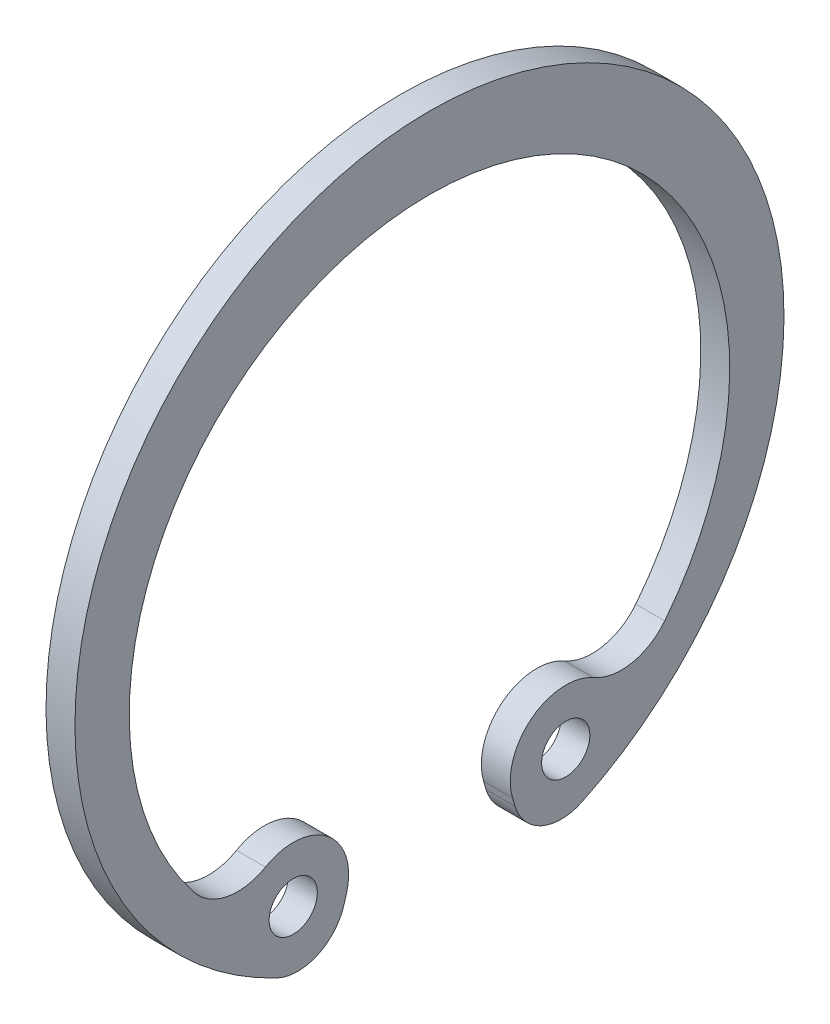
ISO-10303-21;
HEADER;
FILE_DESCRIPTION(('STEP AP214'),'2;1');
FILE_NAME('part.step','',(''),(''),'','','');
FILE_SCHEMA(('AUTOMOTIVE_DESIGN { 1 0 10303 214 1 1 1 1 }'));
ENDSEC;
DATA;
#1=APPLICATION_CONTEXT('core data for automotive mechanical design processes');
#2=APPLICATION_PROTOCOL_DEFINITION('international standard','automotive_design',2000,#1);
#3=PRODUCT_CONTEXT('',#1,'mechanical');
#4=PRODUCT('Part','Part','',(#3));
#5=PRODUCT_RELATED_PRODUCT_CATEGORY('part','',(#4));
#6=PRODUCT_DEFINITION_FORMATION('','',#4);
#7=PRODUCT_DEFINITION_CONTEXT('part definition',#1,'design');
#8=PRODUCT_DEFINITION('design','',#6,#7);
#9=PRODUCT_DEFINITION_SHAPE('','',#8);
#10=(LENGTH_UNIT() NAMED_UNIT(*) SI_UNIT(.MILLI.,.METRE.));
#11=(NAMED_UNIT(*) PLANE_ANGLE_UNIT() SI_UNIT($,.RADIAN.));
#12=(NAMED_UNIT(*) SI_UNIT($,.STERADIAN.) SOLID_ANGLE_UNIT());
#13=UNCERTAINTY_MEASURE_WITH_UNIT(LENGTH_MEASURE(1.E-05),#10,'distance_accuracy_value','');
#14=(GEOMETRIC_REPRESENTATION_CONTEXT(3) GLOBAL_UNCERTAINTY_ASSIGNED_CONTEXT((#13)) GLOBAL_UNIT_ASSIGNED_CONTEXT((#10,
#11,#12)) REPRESENTATION_CONTEXT('',''));
#15=CARTESIAN_POINT('',(0.,0.,0.));
#16=DIRECTION('',(0.,0.,1.));
#17=DIRECTION('',(1.,0.,0.));
#18=AXIS2_PLACEMENT_3D('',#15,#16,#17);
#19=CARTESIAN_POINT('',(0.6,-11.4649523103758,-5.46304571835183));
#20=DIRECTION('',(-1.,0.,0.));
#21=DIRECTION('',(0.,-0.902752150423427,-0.430161080184945));
#22=AXIS2_PLACEMENT_3D('',#19,#20,#21);
#23=CYLINDRICAL_SURFACE('',#22,2.00000000000042);
#24=CARTESIAN_POINT('',(-0.6,-11.4649523103758,-5.46304571835183));
#25=DIRECTION('',(1.,0.,0.));
#26=DIRECTION('',(0.,-0.28262789167806,0.959229625713059));
#27=AXIS2_PLACEMENT_3D('',#24,#25,#26);
#28=CIRCLE('',#27,2.00000000000042);
#29=CARTESIAN_POINT('',(-0.6,-12.030208093732,-3.5445864669253));
#30=VERTEX_POINT('',#29);
#31=CARTESIAN_POINT('',(-0.6,-13.270456611223,-6.3233678787219));
#32=VERTEX_POINT('',#31);
#33=EDGE_CURVE('E96',#30,#32,#28,.T.);
#34=ORIENTED_EDGE('',*,*,#33,.T.);
#35=DIRECTION('',(1.,0.,0.));
#36=VECTOR('',#35,1.);
#37=CARTESIAN_POINT('',(-0.6,-13.270456611223,-6.3233678787219));
#38=LINE('',#37,#36);
#39=CARTESIAN_POINT('',(0.6,-13.270456611223,-6.3233678787219));
#40=VERTEX_POINT('',#39);
#41=EDGE_CURVE('E110',#40,#32,#38,.F.);
#42=ORIENTED_EDGE('',*,*,#41,.F.);
#43=CARTESIAN_POINT('',(0.6,-11.4649523103758,-5.46304571835183));
#44=DIRECTION('',(-1.,0.,0.));
#45=DIRECTION('',(0.,-0.902752150423427,-0.430161080184944));
#46=AXIS2_PLACEMENT_3D('',#43,#44,#45);
#47=CIRCLE('',#46,2.00000000000042);
#48=CARTESIAN_POINT('',(0.6,-12.030208093732,-3.5445864669253));
#49=VERTEX_POINT('',#48);
#50=EDGE_CURVE('E116',#49,#40,#47,.F.);
#51=ORIENTED_EDGE('',*,*,#50,.F.);
#52=DIRECTION('',(-1.,0.,0.));
#53=VECTOR('',#52,1.);
#54=CARTESIAN_POINT('',(0.6,-12.030208093732,-3.5445864669253));
#55=LINE('',#54,#53);
#56=EDGE_CURVE('E104',#49,#30,#55,.T.);
#57=ORIENTED_EDGE('',*,*,#56,.T.);
#58=EDGE_LOOP('',(#34,#42,#51,#57));
#59=FACE_BOUND('',#58,.T.);
#60=ADVANCED_FACE('F17',(#59),#23,.T.);
#61=CARTESIAN_POINT('',(0.6,0.,0.));
#62=DIRECTION('',(-1.,0.,0.));
#63=DIRECTION('',(0.,1.,0.));
#64=AXIS2_PLACEMENT_3D('',#61,#62,#63);
#65=CYLINDRICAL_SURFACE('',#64,14.7);
#66=ORIENTED_EDGE('',*,*,#41,.T.);
#67=CARTESIAN_POINT('',(-0.6,0.,0.));
#68=DIRECTION('',(1.,0.,0.));
#69=DIRECTION('',(0.,-0.902752150423324,-0.430161080185161));
#70=AXIS2_PLACEMENT_3D('',#67,#68,#69);
#71=CIRCLE('',#70,14.7);
#72=CARTESIAN_POINT('',(-0.6,-13.2704566112229,6.32336787872187));
#73=VERTEX_POINT('',#72);
#74=EDGE_CURVE('E92',#32,#73,#71,.T.);
#75=ORIENTED_EDGE('',*,*,#74,.T.);
#76=DIRECTION('',(1.,0.,0.));
#77=VECTOR('',#76,1.);
#78=CARTESIAN_POINT('',(-0.6,-13.2704566112229,6.32336787872186));
#79=LINE('',#78,#77);
#80=CARTESIAN_POINT('',(0.6,-13.2704566112229,6.32336787872186));
#81=VERTEX_POINT('',#80);
#82=EDGE_CURVE('E103',#81,#73,#79,.F.);
#83=ORIENTED_EDGE('',*,*,#82,.F.);
#84=CARTESIAN_POINT('',(0.6,0.,0.));
#85=DIRECTION('',(-1.,0.,0.));
#86=DIRECTION('',(0.,-0.902752150423324,0.430161080185161));
#87=AXIS2_PLACEMENT_3D('',#84,#85,#86);
#88=CIRCLE('',#87,14.7);
#89=EDGE_CURVE('E115',#40,#81,#88,.F.);
#90=ORIENTED_EDGE('',*,*,#89,.F.);
#91=EDGE_LOOP('',(#66,#75,#83,#90));
#92=FACE_BOUND('',#91,.T.);
#93=ADVANCED_FACE('F114',(#92),#65,.T.);
#94=CARTESIAN_POINT('',(0.6,-11.4649523103758,5.46304571835183));
#95=DIRECTION('',(-1.,0.,0.));
#96=DIRECTION('',(0.,-0.282627891678059,-0.959229625713059));
#97=AXIS2_PLACEMENT_3D('',#94,#95,#96);
#98=CYLINDRICAL_SURFACE('',#97,2.00000000000042);
#99=CARTESIAN_POINT('',(-0.6,-11.4649523103758,5.46304571835183));
#100=DIRECTION('',(1.,0.,0.));
#101=DIRECTION('',(0.,-0.902752150423429,0.430161080184941));
#102=AXIS2_PLACEMENT_3D('',#99,#100,#101);
#103=CIRCLE('',#102,2.00000000000042);
#104=CARTESIAN_POINT('',(-0.6,-12.030208093732,3.5445864669253));
#105=VERTEX_POINT('',#104);
#106=EDGE_CURVE('E98',#73,#105,#103,.T.);
#107=ORIENTED_EDGE('',*,*,#106,.T.);
#108=DIRECTION('',(1.,0.,0.));
#109=VECTOR('',#108,1.);
#110=CARTESIAN_POINT('',(-0.6,-12.030208093732,3.5445864669253));
#111=LINE('',#110,#109);
#112=CARTESIAN_POINT('',(0.6,-12.030208093732,3.5445864669253));
#113=VERTEX_POINT('',#112);
#114=EDGE_CURVE('E138',#113,#105,#111,.F.);
#115=ORIENTED_EDGE('',*,*,#114,.F.);
#116=CARTESIAN_POINT('',(0.6,-11.4649523103758,5.46304571835183));
#117=DIRECTION('',(-1.,0.,0.));
#118=DIRECTION('',(0.,-0.282627891678059,-0.959229625713059));
#119=AXIS2_PLACEMENT_3D('',#116,#117,#118);
#120=CIRCLE('',#119,2.00000000000042);
#121=EDGE_CURVE('E143',#81,#113,#120,.F.);
#122=ORIENTED_EDGE('',*,*,#121,.F.);
#123=ORIENTED_EDGE('',*,*,#82,.T.);
#124=EDGE_LOOP('',(#107,#115,#122,#123));
#125=FACE_BOUND('',#124,.T.);
#126=ADVANCED_FACE('F263',(#125),#98,.T.);
#127=CARTESIAN_POINT('',(-0.6,-11.68804668755,3.4437718608598));
#128=DIRECTION('',(0.,-0.282627891677525,-0.959229625713216));
#129=DIRECTION('',(1.,0.,0.));
#130=AXIS2_PLACEMENT_3D('',#127,#128,#129);
#131=PLANE('',#130);
#132=DIRECTION('',(0.,0.959229625713217,-0.282627891677525));
#133=VECTOR('',#132,1.);
#134=CARTESIAN_POINT('',(-0.6,-12.030208093732,3.5445864669253));
#135=LINE('',#134,#133);
#136=CARTESIAN_POINT('',(-0.6,-11.68804668755,3.4437718608598));
#137=VERTEX_POINT('',#136);
#138=EDGE_CURVE('E147',#105,#137,#135,.T.);
#139=ORIENTED_EDGE('',*,*,#138,.T.);
#140=DIRECTION('',(1.,0.,0.));
#141=VECTOR('',#140,1.);
#142=CARTESIAN_POINT('',(-0.6,-11.68804668755,3.4437718608598));
#143=LINE('',#142,#141);
#144=CARTESIAN_POINT('',(0.6,-11.68804668755,3.4437718608598));
#145=VERTEX_POINT('',#144);
#146=EDGE_CURVE('E152',#145,#137,#143,.F.);
#147=ORIENTED_EDGE('',*,*,#146,.F.);
#148=DIRECTION('',(0.,-0.959229625713217,0.282627891677525));
#149=VECTOR('',#148,1.);
#150=CARTESIAN_POINT('',(0.6,-11.68804668755,3.4437718608598));
#151=LINE('',#150,#149);
#152=EDGE_CURVE('E157',#113,#145,#151,.F.);
#153=ORIENTED_EDGE('',*,*,#152,.F.);
#154=ORIENTED_EDGE('',*,*,#114,.T.);
#155=EDGE_LOOP('',(#139,#147,#153,#154));
#156=FACE_BOUND('',#155,.T.);
#157=ADVANCED_FACE('F268',(#156),#131,.T.);
#158=CARTESIAN_POINT('',(0.6,-11.0380025366911,5.65));
#159=DIRECTION('',(-1.,0.,0.));
#160=DIRECTION('',(0.,0.865613782187152,0.500712272755176));
#161=AXIS2_PLACEMENT_3D('',#158,#159,#160);
#162=CYLINDRICAL_SURFACE('',#161,2.3);
#163=CARTESIAN_POINT('',(-0.6,-11.0380025366911,5.65));
#164=DIRECTION('',(1.,0.,0.));
#165=DIRECTION('',(0.,-0.282627891677771,-0.959229625713144));
#166=AXIS2_PLACEMENT_3D('',#163,#164,#165);
#167=CIRCLE('',#166,2.3);
#168=CARTESIAN_POINT('',(-0.6,-9.04709083766069,6.80163822733691));
#169=VERTEX_POINT('',#168);
#170=EDGE_CURVE('E161',#137,#169,#167,.T.);
#171=ORIENTED_EDGE('',*,*,#170,.T.);
#172=DIRECTION('',(1.,0.,0.));
#173=VECTOR('',#172,1.);
#174=CARTESIAN_POINT('',(-0.6,-9.04709083766069,6.80163822733691));
#175=LINE('',#174,#173);
#176=CARTESIAN_POINT('',(0.6,-9.04709083766069,6.80163822733691));
#177=VERTEX_POINT('',#176);
#178=EDGE_CURVE('E166',#177,#169,#175,.F.);
#179=ORIENTED_EDGE('',*,*,#178,.F.);
#180=CARTESIAN_POINT('',(0.6,-11.0380025366911,5.65));
#181=DIRECTION('',(-1.,0.,0.));
#182=DIRECTION('',(0.,0.865613782187152,0.500712272755177));
#183=AXIS2_PLACEMENT_3D('',#180,#181,#182);
#184=CIRCLE('',#183,2.3);
#185=EDGE_CURVE('E171',#145,#177,#184,.F.);
#186=ORIENTED_EDGE('',*,*,#185,.F.);
#187=ORIENTED_EDGE('',*,*,#146,.T.);
#188=EDGE_LOOP('',(#171,#179,#186,#187));
#189=FACE_BOUND('',#188,.T.);
#190=ADVANCED_FACE('F272',(#189),#162,.T.);
#191=CARTESIAN_POINT('',(0.6,-7.05617909642331,7.95327638170799));
#192=DIRECTION('',(-1.,0.,0.));
#193=DIRECTION('',(0.,-0.865613800537984,-0.500712241030902));
#194=AXIS2_PLACEMENT_3D('',#191,#192,#193);
#195=CYLINDRICAL_SURFACE('',#194,2.30000000000003);
#196=CARTESIAN_POINT('',(-0.6,-7.05617909642331,7.95327638170799));
#197=DIRECTION('',(-1.,0.,0.));
#198=DIRECTION('',(0.,-0.865613800537984,-0.500712241030901));
#199=AXIS2_PLACEMENT_3D('',#196,#197,#198);
#200=CIRCLE('',#199,2.30000000000003);
#201=CARTESIAN_POINT('',(-0.6,-8.4851654926572,9.7554966455433));
#202=VERTEX_POINT('',#201);
#203=EDGE_CURVE('E175',#202,#169,#200,.F.);
#204=ORIENTED_EDGE('',*,*,#203,.F.);
#205=DIRECTION('',(1.,0.,0.));
#206=VECTOR('',#205,1.);
#207=CARTESIAN_POINT('',(-0.6,-8.4851654926572,9.7554966455433));
#208=LINE('',#207,#206);
#209=CARTESIAN_POINT('',(0.6,-8.48516549265719,9.75549664554331));
#210=VERTEX_POINT('',#209);
#211=EDGE_CURVE('E179',#210,#202,#208,.F.);
#212=ORIENTED_EDGE('',*,*,#211,.F.);
#213=CARTESIAN_POINT('',(0.6,-7.05617909642331,7.95327638170799));
#214=DIRECTION('',(1.,0.,0.));
#215=DIRECTION('',(0.,-0.62129843314516,0.783574027754474));
#216=AXIS2_PLACEMENT_3D('',#213,#214,#215);
#217=CIRCLE('',#216,2.30000000000003);
#218=EDGE_CURVE('E184',#210,#177,#217,.T.);
#219=ORIENTED_EDGE('',*,*,#218,.T.);
#220=ORIENTED_EDGE('',*,*,#178,.T.);
#221=EDGE_LOOP('',(#204,#212,#219,#220));
#222=FACE_BOUND('',#221,.T.);
#223=ADVANCED_FACE('F276',(#222),#195,.F.);
#224=CARTESIAN_POINT('',(0.6,-0.750000000000032,0.));
#225=DIRECTION('',(-1.,0.,0.));
#226=DIRECTION('',(0.,-0.621298433145152,0.78357402775448));
#227=AXIS2_PLACEMENT_3D('',#224,#225,#226);
#228=CYLINDRICAL_SURFACE('',#227,12.45);
#229=ORIENTED_EDGE('',*,*,#211,.T.);
#230=CARTESIAN_POINT('',(-0.6,-0.750000000000032,0.));
#231=DIRECTION('',(-1.,0.,0.));
#232=DIRECTION('',(0.,-0.621298433145152,0.78357402775448));
#233=AXIS2_PLACEMENT_3D('',#230,#231,#232);
#234=CIRCLE('',#233,12.45);
#235=CARTESIAN_POINT('',(-0.6,-8.48516549265717,-9.75549664554328));
#236=VERTEX_POINT('',#235);
#237=EDGE_CURVE('E189',#236,#202,#234,.F.);
#238=ORIENTED_EDGE('',*,*,#237,.F.);
#239=DIRECTION('',(1.,0.,0.));
#240=VECTOR('',#239,1.);
#241=CARTESIAN_POINT('',(-0.6,-8.48516549265718,-9.75549664554328));
#242=LINE('',#241,#240);
#243=CARTESIAN_POINT('',(0.6,-8.48516549265718,-9.75549664554328));
#244=VERTEX_POINT('',#243);
#245=EDGE_CURVE('E193',#244,#236,#242,.F.);
#246=ORIENTED_EDGE('',*,*,#245,.F.);
#247=CARTESIAN_POINT('',(0.6,-0.750000000000032,0.));
#248=DIRECTION('',(1.,0.,0.));
#249=DIRECTION('',(0.,-0.621298433145152,-0.78357402775448));
#250=AXIS2_PLACEMENT_3D('',#247,#248,#249);
#251=CIRCLE('',#250,12.45);
#252=EDGE_CURVE('E198',#244,#210,#251,.T.);
#253=ORIENTED_EDGE('',*,*,#252,.T.);
#254=EDGE_LOOP('',(#229,#238,#246,#253));
#255=FACE_BOUND('',#254,.T.);
#256=ADVANCED_FACE('F280',(#255),#228,.F.);
#257=CARTESIAN_POINT('',(0.6,-7.05617909642331,-7.95327638170799));
#258=DIRECTION('',(-1.,0.,0.));
#259=DIRECTION('',(0.,-0.621298433145161,-0.783574027754473));
#260=AXIS2_PLACEMENT_3D('',#257,#258,#259);
#261=CYLINDRICAL_SURFACE('',#260,2.30000000000003);
#262=CARTESIAN_POINT('',(-0.6,-7.05617909642331,-7.95327638170799));
#263=DIRECTION('',(-1.,0.,0.));
#264=DIRECTION('',(0.,-0.621298433145162,-0.783574027754473));
#265=AXIS2_PLACEMENT_3D('',#262,#263,#264);
#266=CIRCLE('',#265,2.30000000000003);
#267=CARTESIAN_POINT('',(-0.6,-9.0470908376607,-6.8016382273369));
#268=VERTEX_POINT('',#267);
#269=EDGE_CURVE('E203',#268,#236,#266,.F.);
#270=ORIENTED_EDGE('',*,*,#269,.F.);
#271=DIRECTION('',(1.,0.,0.));
#272=VECTOR('',#271,1.);
#273=CARTESIAN_POINT('',(-0.6,-9.0470908376607,-6.8016382273369));
#274=LINE('',#273,#272);
#275=CARTESIAN_POINT('',(0.6,-9.0470908376607,-6.8016382273369));
#276=VERTEX_POINT('',#275);
#277=EDGE_CURVE('E207',#276,#268,#274,.F.);
#278=ORIENTED_EDGE('',*,*,#277,.F.);
#279=CARTESIAN_POINT('',(0.6,-7.05617909642331,-7.95327638170799));
#280=DIRECTION('',(1.,0.,0.));
#281=DIRECTION('',(0.,-0.865613800537984,0.500712241030902));
#282=AXIS2_PLACEMENT_3D('',#279,#280,#281);
#283=CIRCLE('',#282,2.30000000000003);
#284=EDGE_CURVE('E212',#276,#244,#283,.T.);
#285=ORIENTED_EDGE('',*,*,#284,.T.);
#286=ORIENTED_EDGE('',*,*,#245,.T.);
#287=EDGE_LOOP('',(#270,#278,#285,#286));
#288=FACE_BOUND('',#287,.T.);
#289=ADVANCED_FACE('F284',(#288),#261,.F.);
#290=CARTESIAN_POINT('',(0.6,-11.0380025366911,-5.65));
#291=DIRECTION('',(-1.,0.,0.));
#292=DIRECTION('',(0.,-0.282627891677771,0.959229625713144));
#293=AXIS2_PLACEMENT_3D('',#290,#291,#292);
#294=CYLINDRICAL_SURFACE('',#293,2.3);
#295=CARTESIAN_POINT('',(-0.6,-11.0380025366911,-5.65));
#296=DIRECTION('',(1.,0.,0.));
#297=DIRECTION('',(0.,0.865613782187152,-0.500712272755177));
#298=AXIS2_PLACEMENT_3D('',#295,#296,#297);
#299=CIRCLE('',#298,2.3);
#300=CARTESIAN_POINT('',(-0.6,-11.68804668755,-3.44377186085977));
#301=VERTEX_POINT('',#300);
#302=EDGE_CURVE('E217',#268,#301,#299,.T.);
#303=ORIENTED_EDGE('',*,*,#302,.T.);
#304=DIRECTION('',(1.,0.,0.));
#305=VECTOR('',#304,1.);
#306=CARTESIAN_POINT('',(-0.6,-11.68804668755,-3.44377186085977));
#307=LINE('',#306,#305);
#308=CARTESIAN_POINT('',(0.6,-11.68804668755,-3.44377186085977));
#309=VERTEX_POINT('',#308);
#310=EDGE_CURVE('E221',#309,#301,#307,.F.);
#311=ORIENTED_EDGE('',*,*,#310,.F.);
#312=CARTESIAN_POINT('',(0.6,-11.0380025366911,-5.65));
#313=DIRECTION('',(-1.,0.,0.));
#314=DIRECTION('',(0.,-0.28262789167777,0.959229625713144));
#315=AXIS2_PLACEMENT_3D('',#312,#313,#314);
#316=CIRCLE('',#315,2.3);
#317=EDGE_CURVE('E32',#276,#309,#316,.F.);
#318=ORIENTED_EDGE('',*,*,#317,.F.);
#319=ORIENTED_EDGE('',*,*,#277,.T.);
#320=EDGE_LOOP('',(#303,#311,#318,#319));
#321=FACE_BOUND('',#320,.T.);
#322=ADVANCED_FACE('F288',(#321),#294,.T.);
#323=CARTESIAN_POINT('',(-0.6,-12.030208093732,-3.5445864669253));
#324=DIRECTION('',(0.,-0.282627891677525,0.959229625713216));
#325=DIRECTION('',(1.,0.,0.));
#326=AXIS2_PLACEMENT_3D('',#323,#324,#325);
#327=PLANE('',#326);
#328=DIRECTION('',(0.,-0.959229625713217,-0.282627891677525));
#329=VECTOR('',#328,1.);
#330=CARTESIAN_POINT('',(-0.6,-11.68804668755,-3.4437718608598));
#331=LINE('',#330,#329);
#332=EDGE_CURVE('E40',#301,#30,#331,.T.);
#333=ORIENTED_EDGE('',*,*,#332,.T.);
#334=ORIENTED_EDGE('',*,*,#56,.F.);
#335=DIRECTION('',(0.,0.959229625713216,0.282627891677526));
#336=VECTOR('',#335,1.);
#337=CARTESIAN_POINT('',(0.6,-12.030208093732,-3.5445864669253));
#338=LINE('',#337,#336);
#339=EDGE_CURVE('E232',#309,#49,#338,.F.);
#340=ORIENTED_EDGE('',*,*,#339,.F.);
#341=ORIENTED_EDGE('',*,*,#310,.T.);
#342=EDGE_LOOP('',(#333,#334,#340,#341));
#343=FACE_BOUND('',#342,.T.);
#344=ADVANCED_FACE('F292',(#343),#327,.T.);
#345=CARTESIAN_POINT('',(0.6,-13.4665951227457,14.9730722115581));
#346=DIRECTION('',(1.,0.,0.));
#347=DIRECTION('',(0.,0.,-1.));
#348=AXIS2_PLACEMENT_3D('',#345,#346,#347);
#349=PLANE('',#348);
#350=ORIENTED_EDGE('',*,*,#50,.T.);
#351=ORIENTED_EDGE('',*,*,#89,.T.);
#352=ORIENTED_EDGE('',*,*,#121,.T.);
#353=ORIENTED_EDGE('',*,*,#152,.T.);
#354=ORIENTED_EDGE('',*,*,#185,.T.);
#355=ORIENTED_EDGE('',*,*,#218,.F.);
#356=ORIENTED_EDGE('',*,*,#252,.F.);
#357=ORIENTED_EDGE('',*,*,#284,.F.);
#358=ORIENTED_EDGE('',*,*,#317,.T.);
#359=ORIENTED_EDGE('',*,*,#339,.T.);
#360=EDGE_LOOP('',(#350,#351,#352,#353,#354,#355,#356,#357,#358,#359));
#361=FACE_BOUND('',#360,.T.);
#362=CARTESIAN_POINT('',(0.6,-11.038002536691,-5.65));
#363=DIRECTION('',(-1.,0.,0.));
#364=DIRECTION('',(0.,0.,-1.));
#365=AXIS2_PLACEMENT_3D('',#362,#363,#364);
#366=CIRCLE('',#365,1.);
#367=CARTESIAN_POINT('',(0.6,-11.038002536691,-6.65));
#368=VERTEX_POINT('',#367);
#369=EDGE_CURVE('E236',#368,#368,#366,.F.);
#370=ORIENTED_EDGE('',*,*,#369,.F.);
#371=EDGE_LOOP('',(#370));
#372=FACE_BOUND('',#371,.T.);
#373=CARTESIAN_POINT('',(0.6,-11.038002536691,5.65));
#374=DIRECTION('',(-1.,0.,0.));
#375=DIRECTION('',(0.,0.,-1.));
#376=AXIS2_PLACEMENT_3D('',#373,#374,#375);
#377=CIRCLE('',#376,1.);
#378=CARTESIAN_POINT('',(0.6,-11.038002536691,4.65));
#379=VERTEX_POINT('',#378);
#380=EDGE_CURVE('E241',#379,#379,#377,.F.);
#381=ORIENTED_EDGE('',*,*,#380,.F.);
#382=EDGE_LOOP('',(#381));
#383=FACE_BOUND('',#382,.T.);
#384=ADVANCED_FACE('F256',(#361,#372,#383),#349,.T.);
#385=CARTESIAN_POINT('',(-0.6,-13.4665951227457,14.7000000245575));
#386=DIRECTION('',(-1.,0.,0.));
#387=DIRECTION('',(0.,1.,0.));
#388=AXIS2_PLACEMENT_3D('',#385,#386,#387);
#389=PLANE('',#388);
#390=ORIENTED_EDGE('',*,*,#74,.F.);
#391=ORIENTED_EDGE('',*,*,#33,.F.);
#392=ORIENTED_EDGE('',*,*,#332,.F.);
#393=ORIENTED_EDGE('',*,*,#302,.F.);
#394=ORIENTED_EDGE('',*,*,#269,.T.);
#395=ORIENTED_EDGE('',*,*,#237,.T.);
#396=ORIENTED_EDGE('',*,*,#203,.T.);
#397=ORIENTED_EDGE('',*,*,#170,.F.);
#398=ORIENTED_EDGE('',*,*,#138,.F.);
#399=ORIENTED_EDGE('',*,*,#106,.F.);
#400=EDGE_LOOP('',(#390,#391,#392,#393,#394,#395,#396,#397,#398,#399));
#401=FACE_BOUND('',#400,.T.);
#402=CARTESIAN_POINT('',(-0.6,-11.038002536691,-5.65));
#403=DIRECTION('',(1.,0.,0.));
#404=DIRECTION('',(0.,-1.42053957929992E-07,0.99999999999999));
#405=AXIS2_PLACEMENT_3D('',#402,#403,#404);
#406=CIRCLE('',#405,1.);
#407=CARTESIAN_POINT('',(-0.6,-11.038002678745,-4.65000000000001));
#408=VERTEX_POINT('',#407);
#409=EDGE_CURVE('E25',#408,#408,#406,.T.);
#410=ORIENTED_EDGE('',*,*,#409,.T.);
#411=EDGE_LOOP('',(#410));
#412=FACE_BOUND('',#411,.T.);
#413=CARTESIAN_POINT('',(-0.6,-11.038002536691,5.65));
#414=DIRECTION('',(1.,0.,0.));
#415=DIRECTION('',(0.,-1.42053860230366E-07,0.99999999999999));
#416=AXIS2_PLACEMENT_3D('',#413,#414,#415);
#417=CIRCLE('',#416,1.);
#418=CARTESIAN_POINT('',(-0.6,-11.0380026787449,6.64999999999999));
#419=VERTEX_POINT('',#418);
#420=EDGE_CURVE('E11',#419,#419,#417,.T.);
#421=ORIENTED_EDGE('',*,*,#420,.T.);
#422=EDGE_LOOP('',(#421));
#423=FACE_BOUND('',#422,.T.);
#424=ADVANCED_FACE('F94',(#401,#412,#423),#389,.T.);
#425=CARTESIAN_POINT('',(0.6,-11.038002536691,-5.65));
#426=DIRECTION('',(-1.,0.,0.));
#427=DIRECTION('',(0.,0.,-1.));
#428=AXIS2_PLACEMENT_3D('',#425,#426,#427);
#429=CYLINDRICAL_SURFACE('',#428,1.);
#430=ORIENTED_EDGE('',*,*,#369,.T.);
#431=EDGE_LOOP('',(#430));
#432=FACE_BOUND('',#431,.T.);
#433=ORIENTED_EDGE('',*,*,#409,.F.);
#434=EDGE_LOOP('',(#433));
#435=FACE_BOUND('',#434,.T.);
#436=ADVANCED_FACE('F247',(#432,#435),#429,.F.);
#437=CARTESIAN_POINT('',(0.6,-11.038002536691,5.65));
#438=DIRECTION('',(-1.,0.,0.));
#439=DIRECTION('',(0.,0.,-1.));
#440=AXIS2_PLACEMENT_3D('',#437,#438,#439);
#441=CYLINDRICAL_SURFACE('',#440,1.);
#442=ORIENTED_EDGE('',*,*,#380,.T.);
#443=EDGE_LOOP('',(#442));
#444=FACE_BOUND('',#443,.T.);
#445=ORIENTED_EDGE('',*,*,#420,.F.);
#446=EDGE_LOOP('',(#445));
#447=FACE_BOUND('',#446,.T.);
#448=ADVANCED_FACE('F19',(#444,#447),#441,.F.);
#449=CLOSED_SHELL('',(#60,#93,#126,#157,#190,#223,#256,#289,#322,#344,#384,#424,#436,#448));
#450=MANIFOLD_SOLID_BREP('B1',#449);
#451=ADVANCED_BREP_SHAPE_REPRESENTATION('',(#18,#450),#14);
#452=SHAPE_DEFINITION_REPRESENTATION(#9,#451);
ENDSEC;
END-ISO-10303-21;
